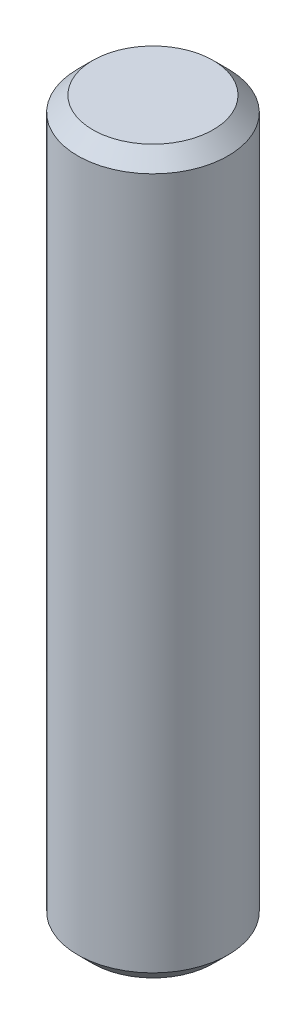
ISO-10303-21;
HEADER;
FILE_DESCRIPTION(('STEP AP214'),'2;1');
FILE_NAME('part.step','',(''),(''),'','','');
FILE_SCHEMA(('AUTOMOTIVE_DESIGN { 1 0 10303 214 1 1 1 1 }'));
ENDSEC;
DATA;
#1=APPLICATION_CONTEXT('core data for automotive mechanical design processes');
#2=APPLICATION_PROTOCOL_DEFINITION('international standard','automotive_design',2000,#1);
#3=PRODUCT_CONTEXT('',#1,'mechanical');
#4=PRODUCT('Part','Part','',(#3));
#5=PRODUCT_RELATED_PRODUCT_CATEGORY('part','',(#4));
#6=PRODUCT_DEFINITION_FORMATION('','',#4);
#7=PRODUCT_DEFINITION_CONTEXT('part definition',#1,'design');
#8=PRODUCT_DEFINITION('design','',#6,#7);
#9=PRODUCT_DEFINITION_SHAPE('','',#8);
#10=(LENGTH_UNIT() NAMED_UNIT(*) SI_UNIT(.MILLI.,.METRE.));
#11=(NAMED_UNIT(*) PLANE_ANGLE_UNIT() SI_UNIT($,.RADIAN.));
#12=(NAMED_UNIT(*) SI_UNIT($,.STERADIAN.) SOLID_ANGLE_UNIT());
#13=UNCERTAINTY_MEASURE_WITH_UNIT(LENGTH_MEASURE(1.E-05),#10,'distance_accuracy_value','');
#14=(GEOMETRIC_REPRESENTATION_CONTEXT(3) GLOBAL_UNCERTAINTY_ASSIGNED_CONTEXT((#13)) GLOBAL_UNIT_ASSIGNED_CONTEXT((#10,
#11,#12)) REPRESENTATION_CONTEXT('',''));
#15=CARTESIAN_POINT('',(0.,0.,0.));
#16=DIRECTION('',(0.,0.,1.));
#17=DIRECTION('',(1.,0.,0.));
#18=AXIS2_PLACEMENT_3D('',#15,#16,#17);
#19=CARTESIAN_POINT('',(0.,0.,0.));
#20=DIRECTION('',(0.,-1.,0.));
#21=DIRECTION('',(1.,0.,0.));
#22=AXIS2_PLACEMENT_3D('',#19,#20,#21);
#23=PLANE('',#22);
#24=CARTESIAN_POINT('',(0.,0.,0.));
#25=DIRECTION('',(0.,1.,0.));
#26=DIRECTION('',(-1.,0.,0.));
#27=AXIS2_PLACEMENT_3D('',#24,#25,#26);
#28=CIRCLE('',#27,3.99999999999999);
#29=CARTESIAN_POINT('',(-3.99999999999999,0.,0.));
#30=VERTEX_POINT('',#29);
#31=EDGE_CURVE('E10',#30,#30,#28,.T.);
#32=ORIENTED_EDGE('',*,*,#31,.F.);
#33=EDGE_LOOP('',(#32));
#34=FACE_BOUND('',#33,.T.);
#35=ADVANCED_FACE('F31',(#34),#23,.T.);
#36=CARTESIAN_POINT('',(0.,1.,0.));
#37=DIRECTION('',(0.,1.,0.));
#38=DIRECTION('',(-1.,0.,0.));
#39=AXIS2_PLACEMENT_3D('',#36,#37,#38);
#40=CONICAL_SURFACE('',#39,4.99999999999999,0.785398163397448);
#41=ORIENTED_EDGE('',*,*,#31,.T.);
#42=EDGE_LOOP('',(#41));
#43=FACE_BOUND('',#42,.T.);
#44=CARTESIAN_POINT('',(0.,1.,0.));
#45=DIRECTION('',(0.,1.,0.));
#46=DIRECTION('',(-1.,0.,0.));
#47=AXIS2_PLACEMENT_3D('',#44,#45,#46);
#48=CIRCLE('',#47,4.99999999999999);
#49=CARTESIAN_POINT('',(-4.99999999999999,1.,0.));
#50=VERTEX_POINT('',#49);
#51=EDGE_CURVE('E37',#50,#50,#48,.T.);
#52=ORIENTED_EDGE('',*,*,#51,.F.);
#53=EDGE_LOOP('',(#52));
#54=FACE_BOUND('',#53,.T.);
#55=ADVANCED_FACE('F63',(#43,#54),#40,.T.);
#56=CARTESIAN_POINT('',(0.,48.,0.));
#57=DIRECTION('',(0.,1.,0.));
#58=DIRECTION('',(-1.,0.,0.));
#59=AXIS2_PLACEMENT_3D('',#56,#57,#58);
#60=CYLINDRICAL_SURFACE('',#59,5.);
#61=ORIENTED_EDGE('',*,*,#51,.T.);
#62=EDGE_LOOP('',(#61));
#63=FACE_BOUND('',#62,.T.);
#64=CARTESIAN_POINT('',(0.,47.,0.));
#65=DIRECTION('',(0.,1.,0.));
#66=DIRECTION('',(-1.,0.,0.));
#67=AXIS2_PLACEMENT_3D('',#64,#65,#66);
#68=CIRCLE('',#67,5.);
#69=CARTESIAN_POINT('',(-4.99999999999999,47.,0.));
#70=VERTEX_POINT('',#69);
#71=EDGE_CURVE('E41',#70,#70,#68,.T.);
#72=ORIENTED_EDGE('',*,*,#71,.F.);
#73=EDGE_LOOP('',(#72));
#74=FACE_BOUND('',#73,.T.);
#75=ADVANCED_FACE('F55',(#63,#74),#60,.T.);
#76=CARTESIAN_POINT('',(0.,48.,0.));
#77=DIRECTION('',(0.,-1.,0.));
#78=DIRECTION('',(1.,0.,0.));
#79=AXIS2_PLACEMENT_3D('',#76,#77,#78);
#80=CONICAL_SURFACE('',#79,4.,0.785398163397452);
#81=ORIENTED_EDGE('',*,*,#71,.T.);
#82=EDGE_LOOP('',(#81));
#83=FACE_BOUND('',#82,.T.);
#84=CARTESIAN_POINT('',(0.,48.,0.));
#85=DIRECTION('',(0.,1.,0.));
#86=DIRECTION('',(-1.,0.,0.));
#87=AXIS2_PLACEMENT_3D('',#84,#85,#86);
#88=CIRCLE('',#87,4.);
#89=CARTESIAN_POINT('',(-4.,48.,0.));
#90=VERTEX_POINT('',#89);
#91=EDGE_CURVE('E45',#90,#90,#88,.T.);
#92=ORIENTED_EDGE('',*,*,#91,.F.);
#93=EDGE_LOOP('',(#92));
#94=FACE_BOUND('',#93,.T.);
#95=ADVANCED_FACE('F53',(#83,#94),#80,.T.);
#96=CARTESIAN_POINT('',(-4.,48.,0.));
#97=DIRECTION('',(0.,1.,0.));
#98=DIRECTION('',(-1.,0.,0.));
#99=AXIS2_PLACEMENT_3D('',#96,#97,#98);
#100=PLANE('',#99);
#101=ORIENTED_EDGE('',*,*,#91,.T.);
#102=EDGE_LOOP('',(#101));
#103=FACE_BOUND('',#102,.T.);
#104=ADVANCED_FACE('F51',(#103),#100,.T.);
#105=CLOSED_SHELL('',(#35,#55,#75,#95,#104));
#106=MANIFOLD_SOLID_BREP('B2',#105);
#107=ADVANCED_BREP_SHAPE_REPRESENTATION('',(#18,#106),#14);
#108=SHAPE_DEFINITION_REPRESENTATION(#9,#107);
ENDSEC;
END-ISO-10303-21;
